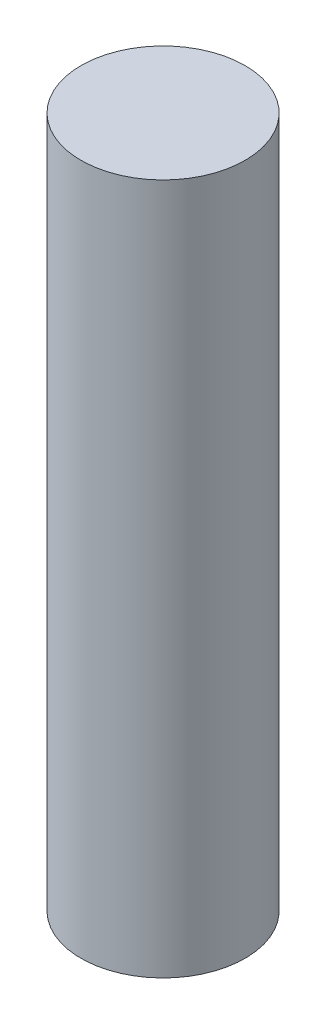
ISO-10303-21;
HEADER;
FILE_DESCRIPTION(('STEP AP214'),'2;1');
FILE_NAME('part.step','',(''),(''),'','','');
FILE_SCHEMA(('AUTOMOTIVE_DESIGN { 1 0 10303 214 1 1 1 1 }'));
ENDSEC;
DATA;
#1=APPLICATION_CONTEXT('core data for automotive mechanical design processes');
#2=APPLICATION_PROTOCOL_DEFINITION('international standard','automotive_design',2000,#1);
#3=PRODUCT_CONTEXT('',#1,'mechanical');
#4=PRODUCT('Part','Part','',(#3));
#5=PRODUCT_RELATED_PRODUCT_CATEGORY('part','',(#4));
#6=PRODUCT_DEFINITION_FORMATION('','',#4);
#7=PRODUCT_DEFINITION_CONTEXT('part definition',#1,'design');
#8=PRODUCT_DEFINITION('design','',#6,#7);
#9=PRODUCT_DEFINITION_SHAPE('','',#8);
#10=(LENGTH_UNIT() NAMED_UNIT(*) SI_UNIT(.MILLI.,.METRE.));
#11=(NAMED_UNIT(*) PLANE_ANGLE_UNIT() SI_UNIT($,.RADIAN.));
#12=(NAMED_UNIT(*) SI_UNIT($,.STERADIAN.) SOLID_ANGLE_UNIT());
#13=UNCERTAINTY_MEASURE_WITH_UNIT(LENGTH_MEASURE(1.E-05),#10,'distance_accuracy_value','');
#14=(GEOMETRIC_REPRESENTATION_CONTEXT(3) GLOBAL_UNCERTAINTY_ASSIGNED_CONTEXT((#13)) GLOBAL_UNIT_ASSIGNED_CONTEXT((#10,
#11,#12)) REPRESENTATION_CONTEXT('',''));
#15=CARTESIAN_POINT('',(0.,0.,0.));
#16=DIRECTION('',(0.,0.,1.));
#17=DIRECTION('',(1.,0.,0.));
#18=AXIS2_PLACEMENT_3D('',#15,#16,#17);
#19=CARTESIAN_POINT('',(0.,400.,0.));
#20=DIRECTION('',(0.,-1.,0.));
#21=DIRECTION('',(0.,0.,-1.));
#22=AXIS2_PLACEMENT_3D('',#19,#20,#21);
#23=CYLINDRICAL_SURFACE('',#22,47.5088649243937);
#24=CARTESIAN_POINT('',(0.,400.,0.));
#25=DIRECTION('',(0.,1.,0.));
#26=DIRECTION('',(0.,0.,1.));
#27=AXIS2_PLACEMENT_3D('',#24,#25,#26);
#28=CIRCLE('',#27,47.5088649243937);
#29=CARTESIAN_POINT('',(0.,400.,-47.5088649243937));
#30=VERTEX_POINT('',#29);
#31=EDGE_CURVE('E10',#30,#30,#28,.T.);
#32=CARTESIAN_POINT('',(0.,0.,0.));
#33=DIRECTION('',(0.,1.,0.));
#34=DIRECTION('',(0.,0.,1.));
#35=AXIS2_PLACEMENT_3D('',#32,#33,#34);
#36=CIRCLE('',#35,47.5088649243937);
#37=CARTESIAN_POINT('',(0.,0.,-47.5088649243937));
#38=VERTEX_POINT('',#37);
#39=EDGE_CURVE('E37',#38,#38,#36,.T.);
#40=CARTESIAN_POINT('',(0.,400.,-47.5088649243937));
#41=CARTESIAN_POINT('',(0.,395.833333333333,-47.5088649243937));
#42=CARTESIAN_POINT('',(0.,391.666666666667,-47.5088649243937));
#43=CARTESIAN_POINT('',(0.,383.333333333334,-47.5088649243937));
#44=CARTESIAN_POINT('',(0.,379.166666666667,-47.5088649243937));
#45=CARTESIAN_POINT('',(0.,370.833333333334,-47.5088649243937));
#46=CARTESIAN_POINT('',(0.,366.666666666667,-47.5088649243937));
#47=CARTESIAN_POINT('',(0.,358.333333333333,-47.5088649243937));
#48=CARTESIAN_POINT('',(0.,354.166666666667,-47.5088649243937));
#49=CARTESIAN_POINT('',(0.,345.833333333333,-47.5088649243937));
#50=CARTESIAN_POINT('',(0.,341.666666666667,-47.5088649243937));
#51=CARTESIAN_POINT('',(0.,333.333333333333,-47.5088649243937));
#52=CARTESIAN_POINT('',(0.,329.166666666667,-47.5088649243937));
#53=CARTESIAN_POINT('',(0.,320.833333333333,-47.5088649243937));
#54=CARTESIAN_POINT('',(0.,316.666666666667,-47.5088649243937));
#55=CARTESIAN_POINT('',(0.,308.333333333333,-47.5088649243937));
#56=CARTESIAN_POINT('',(0.,304.166666666667,-47.5088649243937));
#57=CARTESIAN_POINT('',(0.,295.833333333333,-47.5088649243937));
#58=CARTESIAN_POINT('',(0.,291.666666666667,-47.5088649243937));
#59=CARTESIAN_POINT('',(0.,283.333333333333,-47.5088649243937));
#60=CARTESIAN_POINT('',(0.,279.166666666667,-47.5088649243937));
#61=CARTESIAN_POINT('',(0.,270.833333333333,-47.5088649243937));
#62=CARTESIAN_POINT('',(0.,266.666666666667,-47.5088649243937));
#63=CARTESIAN_POINT('',(0.,258.333333333333,-47.5088649243937));
#64=CARTESIAN_POINT('',(0.,254.166666666667,-47.5088649243937));
#65=CARTESIAN_POINT('',(0.,245.833333333333,-47.5088649243937));
#66=CARTESIAN_POINT('',(0.,241.666666666667,-47.5088649243937));
#67=CARTESIAN_POINT('',(0.,233.333333333333,-47.5088649243937));
#68=CARTESIAN_POINT('',(0.,229.166666666667,-47.5088649243937));
#69=CARTESIAN_POINT('',(0.,220.833333333333,-47.5088649243937));
#70=CARTESIAN_POINT('',(0.,216.666666666667,-47.5088649243937));
#71=CARTESIAN_POINT('',(0.,208.333333333333,-47.5088649243937));
#72=CARTESIAN_POINT('',(0.,204.166666666667,-47.5088649243937));
#73=CARTESIAN_POINT('',(0.,195.833333333333,-47.5088649243937));
#74=CARTESIAN_POINT('',(0.,191.666666666667,-47.5088649243937));
#75=CARTESIAN_POINT('',(0.,183.333333333333,-47.5088649243937));
#76=CARTESIAN_POINT('',(0.,179.166666666667,-47.5088649243937));
#77=CARTESIAN_POINT('',(0.,170.833333333333,-47.5088649243937));
#78=CARTESIAN_POINT('',(0.,166.666666666667,-47.5088649243937));
#79=CARTESIAN_POINT('',(0.,158.333333333333,-47.5088649243937));
#80=CARTESIAN_POINT('',(0.,154.166666666667,-47.5088649243937));
#81=CARTESIAN_POINT('',(0.,145.833333333333,-47.5088649243937));
#82=CARTESIAN_POINT('',(0.,141.666666666667,-47.5088649243937));
#83=CARTESIAN_POINT('',(0.,133.333333333333,-47.5088649243937));
#84=CARTESIAN_POINT('',(0.,129.166666666667,-47.5088649243937));
#85=CARTESIAN_POINT('',(0.,120.833333333333,-47.5088649243937));
#86=CARTESIAN_POINT('',(0.,116.666666666667,-47.5088649243937));
#87=CARTESIAN_POINT('',(0.,108.333333333333,-47.5088649243937));
#88=CARTESIAN_POINT('',(0.,104.166666666667,-47.5088649243937));
#89=CARTESIAN_POINT('',(0.,95.8333333333334,-47.5088649243937));
#90=CARTESIAN_POINT('',(0.,91.6666666666667,-47.5088649243937));
#91=CARTESIAN_POINT('',(0.,83.3333333333334,-47.5088649243937));
#92=CARTESIAN_POINT('',(0.,79.1666666666667,-47.5088649243937));
#93=CARTESIAN_POINT('',(0.,70.8333333333334,-47.5088649243937));
#94=CARTESIAN_POINT('',(0.,66.6666666666667,-47.5088649243937));
#95=CARTESIAN_POINT('',(0.,58.3333333333334,-47.5088649243937));
#96=CARTESIAN_POINT('',(0.,54.1666666666667,-47.5088649243937));
#97=CARTESIAN_POINT('',(0.,45.8333333333334,-47.5088649243937));
#98=CARTESIAN_POINT('',(0.,41.6666666666667,-47.5088649243937));
#99=CARTESIAN_POINT('',(0.,33.3333333333334,-47.5088649243937));
#100=CARTESIAN_POINT('',(0.,29.1666666666667,-47.5088649243937));
#101=CARTESIAN_POINT('',(0.,20.8333333333334,-47.5088649243937));
#102=CARTESIAN_POINT('',(0.,16.6666666666667,-47.5088649243937));
#103=CARTESIAN_POINT('',(0.,8.33333333333334,-47.5088649243937));
#104=CARTESIAN_POINT('',(0.,4.16666666666667,-47.5088649243937));
#105=CARTESIAN_POINT('',(0.,0.,-47.5088649243937));
#106=B_SPLINE_CURVE_WITH_KNOTS('',3,(#40,#41,#42,#43,#44,#45,#46,#47,#48,#49,#50,#51,#52,#53,
#54,#55,#56,#57,#58,#59,#60,#61,#62,#63,#64,#65,#66,#67,#68,#69,#70,#71,#72,#73,#74,#75,#76,#77,
#78,#79,#80,#81,#82,#83,#84,#85,#86,#87,#88,#89,#90,#91,#92,#93,#94,#95,#96,#97,#98,#99,#100,
#101,#102,#103,#104,#105),.UNSPECIFIED.,.F.,.F.,(4,2,2,2,2,2,2,2,2,2,2,2,2,2,2,2,2,2,2,2,2,2,2,
2,2,2,2,2,2,2,2,2,4),(0.,12.5,25.,37.5,50.,62.5,75.,87.5,100.,112.5,125.,137.5,150.,162.5,175.,
187.5,200.,212.5,225.,237.5,250.,262.5,275.,287.5,300.,312.5,325.,337.5,350.,362.5,375.,387.5,
400.),.UNSPECIFIED.);
#107=EDGE_CURVE('BSEAM34',#30,#38,#106,.T.);
#108=ORIENTED_EDGE('',*,*,#31,.F.);
#109=ORIENTED_EDGE('',*,*,#39,.T.);
#110=ORIENTED_EDGE('',*,*,#107,.T.);
#111=ORIENTED_EDGE('',*,*,#107,.F.);
#112=EDGE_LOOP('',(#108,#110,#109,#111));
#113=FACE_BOUND('',#112,.T.);
#114=ADVANCED_FACE('F34',(#113),#23,.T.);
#115=CARTESIAN_POINT('',(0.,400.,0.));
#116=DIRECTION('',(0.,1.,0.));
#117=DIRECTION('',(0.,0.,1.));
#118=AXIS2_PLACEMENT_3D('',#115,#116,#117);
#119=PLANE('',#118);
#120=ORIENTED_EDGE('',*,*,#31,.T.);
#121=EDGE_LOOP('',(#120));
#122=FACE_BOUND('',#121,.T.);
#123=ADVANCED_FACE('F49',(#122),#119,.T.);
#124=CARTESIAN_POINT('',(0.,0.,0.));
#125=DIRECTION('',(0.,1.,0.));
#126=DIRECTION('',(0.,0.,1.));
#127=AXIS2_PLACEMENT_3D('',#124,#125,#126);
#128=PLANE('',#127);
#129=ORIENTED_EDGE('',*,*,#39,.F.);
#130=EDGE_LOOP('',(#129));
#131=FACE_BOUND('',#130,.T.);
#132=ADVANCED_FACE('F47',(#131),#128,.F.);
#133=CLOSED_SHELL('',(#114,#123,#132));
#134=MANIFOLD_SOLID_BREP('B2',#133);
#135=ADVANCED_BREP_SHAPE_REPRESENTATION('',(#18,#134),#14);
#136=SHAPE_DEFINITION_REPRESENTATION(#9,#135);
ENDSEC;
END-ISO-10303-21;
